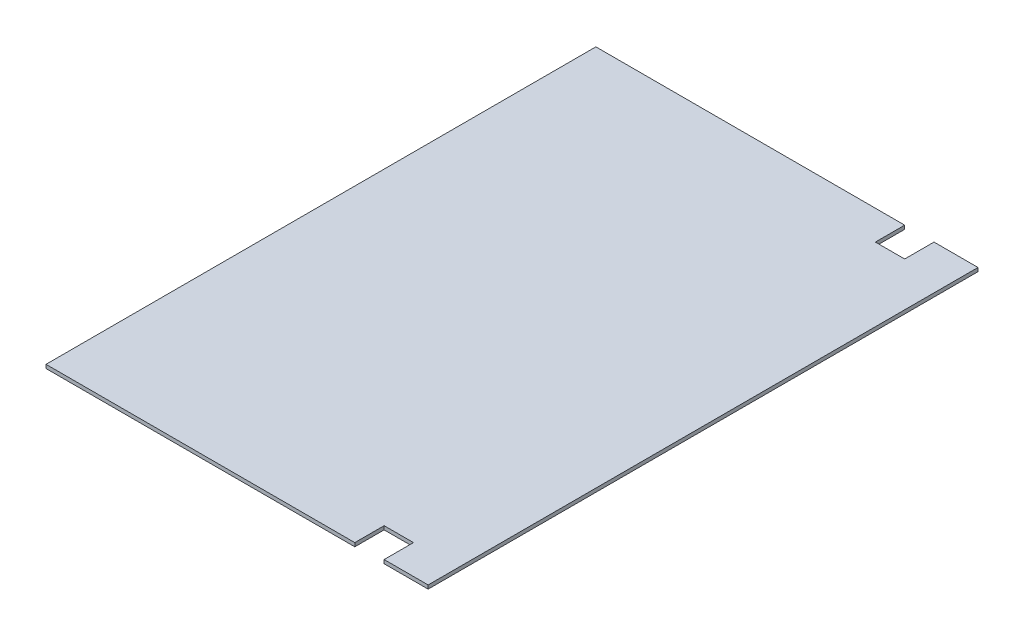
ISO-10303-21;
HEADER;
FILE_DESCRIPTION(('STEP AP214'),'2;1');
FILE_NAME('part.step','',(''),(''),'','','');
FILE_SCHEMA(('AUTOMOTIVE_DESIGN { 1 0 10303 214 1 1 1 1 }'));
ENDSEC;
DATA;
#1=APPLICATION_CONTEXT('core data for automotive mechanical design processes');
#2=APPLICATION_PROTOCOL_DEFINITION('international standard','automotive_design',2000,#1);
#3=PRODUCT_CONTEXT('',#1,'mechanical');
#4=PRODUCT('Part','Part','',(#3));
#5=PRODUCT_RELATED_PRODUCT_CATEGORY('part','',(#4));
#6=PRODUCT_DEFINITION_FORMATION('','',#4);
#7=PRODUCT_DEFINITION_CONTEXT('part definition',#1,'design');
#8=PRODUCT_DEFINITION('design','',#6,#7);
#9=PRODUCT_DEFINITION_SHAPE('','',#8);
#10=(LENGTH_UNIT() NAMED_UNIT(*) SI_UNIT(.MILLI.,.METRE.));
#11=(NAMED_UNIT(*) PLANE_ANGLE_UNIT() SI_UNIT($,.RADIAN.));
#12=(NAMED_UNIT(*) SI_UNIT($,.STERADIAN.) SOLID_ANGLE_UNIT());
#13=UNCERTAINTY_MEASURE_WITH_UNIT(LENGTH_MEASURE(1.E-05),#10,'distance_accuracy_value','');
#14=(GEOMETRIC_REPRESENTATION_CONTEXT(3) GLOBAL_UNCERTAINTY_ASSIGNED_CONTEXT((#13)) GLOBAL_UNIT_ASSIGNED_CONTEXT((#10,
#11,#12)) REPRESENTATION_CONTEXT('',''));
#15=CARTESIAN_POINT('',(0.,0.,0.));
#16=DIRECTION('',(0.,0.,1.));
#17=DIRECTION('',(1.,0.,0.));
#18=AXIS2_PLACEMENT_3D('',#15,#16,#17);
#19=CARTESIAN_POINT('',(0.,3.175,0.));
#20=DIRECTION('',(0.,0.,-1.));
#21=DIRECTION('',(-1.,0.,0.));
#22=AXIS2_PLACEMENT_3D('',#19,#20,#21);
#23=PLANE('',#22);
#24=DIRECTION('',(1.,0.,0.));
#25=VECTOR('',#24,1.);
#26=CARTESIAN_POINT('',(0.,0.,0.));
#27=LINE('',#26,#25);
#28=CARTESIAN_POINT('',(0.,0.,0.));
#29=VERTEX_POINT('',#28);
#30=CARTESIAN_POINT('',(267.462,0.,0.));
#31=VERTEX_POINT('',#30);
#32=EDGE_CURVE('E161',#29,#31,#27,.T.);
#33=ORIENTED_EDGE('',*,*,#32,.T.);
#34=DIRECTION('',(0.,1.,0.));
#35=VECTOR('',#34,1.);
#36=CARTESIAN_POINT('',(267.462,0.,0.));
#37=LINE('',#36,#35);
#38=CARTESIAN_POINT('',(267.462,3.175,0.));
#39=VERTEX_POINT('',#38);
#40=EDGE_CURVE('E144',#31,#39,#37,.T.);
#41=ORIENTED_EDGE('',*,*,#40,.T.);
#42=DIRECTION('',(1.,0.,0.));
#43=VECTOR('',#42,1.);
#44=CARTESIAN_POINT('',(0.,3.175,0.));
#45=LINE('',#44,#43);
#46=CARTESIAN_POINT('',(0.,3.175,0.));
#47=VERTEX_POINT('',#46);
#48=EDGE_CURVE('E191',#47,#39,#45,.T.);
#49=ORIENTED_EDGE('',*,*,#48,.F.);
#50=DIRECTION('',(0.,-1.,0.));
#51=VECTOR('',#50,1.);
#52=CARTESIAN_POINT('',(0.,3.175,0.));
#53=LINE('',#52,#51);
#54=EDGE_CURVE('E11',#47,#29,#53,.T.);
#55=ORIENTED_EDGE('',*,*,#54,.T.);
#56=EDGE_LOOP('',(#33,#41,#49,#55));
#57=FACE_BOUND('',#56,.T.);
#58=ADVANCED_FACE('F43',(#57),#23,.F.);
#59=CARTESIAN_POINT('',(0.,3.175,-476.25));
#60=DIRECTION('',(0.,0.,-1.));
#61=DIRECTION('',(-1.,0.,0.));
#62=AXIS2_PLACEMENT_3D('',#59,#60,#61);
#63=PLANE('',#62);
#64=DIRECTION('',(0.,1.,0.));
#65=VECTOR('',#64,1.);
#66=CARTESIAN_POINT('',(292.862,0.,-476.25));
#67=LINE('',#66,#65);
#68=CARTESIAN_POINT('',(292.862,0.,-476.25));
#69=VERTEX_POINT('',#68);
#70=CARTESIAN_POINT('',(292.862,3.175,-476.25));
#71=VERTEX_POINT('',#70);
#72=EDGE_CURVE('E221',#69,#71,#67,.T.);
#73=ORIENTED_EDGE('',*,*,#72,.T.);
#74=DIRECTION('',(1.,0.,0.));
#75=VECTOR('',#74,1.);
#76=CARTESIAN_POINT('',(0.,3.175,-476.25));
#77=LINE('',#76,#75);
#78=CARTESIAN_POINT('',(330.962,3.175,-476.25));
#79=VERTEX_POINT('',#78);
#80=EDGE_CURVE('E175',#71,#79,#77,.T.);
#81=ORIENTED_EDGE('',*,*,#80,.T.);
#82=DIRECTION('',(0.,-1.,0.));
#83=VECTOR('',#82,1.);
#84=CARTESIAN_POINT('',(330.962,3.175,-476.25));
#85=LINE('',#84,#83);
#86=CARTESIAN_POINT('',(330.962,0.,-476.25));
#87=VERTEX_POINT('',#86);
#88=EDGE_CURVE('E183',#79,#87,#85,.T.);
#89=ORIENTED_EDGE('',*,*,#88,.T.);
#90=DIRECTION('',(1.,0.,0.));
#91=VECTOR('',#90,1.);
#92=CARTESIAN_POINT('',(0.,0.,-476.25));
#93=LINE('',#92,#91);
#94=EDGE_CURVE('E206',#69,#87,#93,.T.);
#95=ORIENTED_EDGE('',*,*,#94,.F.);
#96=EDGE_LOOP('',(#73,#81,#89,#95));
#97=FACE_BOUND('',#96,.T.);
#98=ADVANCED_FACE('F220',(#97),#63,.T.);
#99=CARTESIAN_POINT('',(0.,3.175,0.));
#100=DIRECTION('',(-1.,0.,0.));
#101=DIRECTION('',(0.,0.,1.));
#102=AXIS2_PLACEMENT_3D('',#99,#100,#101);
#103=PLANE('',#102);
#104=DIRECTION('',(0.,0.,-1.));
#105=VECTOR('',#104,1.);
#106=CARTESIAN_POINT('',(0.,0.,0.));
#107=LINE('',#106,#105);
#108=CARTESIAN_POINT('',(0.,0.,-476.25));
#109=VERTEX_POINT('',#108);
#110=EDGE_CURVE('E204',#29,#109,#107,.T.);
#111=ORIENTED_EDGE('',*,*,#110,.F.);
#112=ORIENTED_EDGE('',*,*,#54,.F.);
#113=DIRECTION('',(0.,0.,-1.));
#114=VECTOR('',#113,1.);
#115=CARTESIAN_POINT('',(0.,3.175,0.));
#116=LINE('',#115,#114);
#117=CARTESIAN_POINT('',(0.,3.175,-476.25));
#118=VERTEX_POINT('',#117);
#119=EDGE_CURVE('E169',#47,#118,#116,.T.);
#120=ORIENTED_EDGE('',*,*,#119,.T.);
#121=DIRECTION('',(0.,-1.,0.));
#122=VECTOR('',#121,1.);
#123=CARTESIAN_POINT('',(0.,3.175,-476.25));
#124=LINE('',#123,#122);
#125=EDGE_CURVE('E47',#118,#109,#124,.T.);
#126=ORIENTED_EDGE('',*,*,#125,.T.);
#127=EDGE_LOOP('',(#111,#112,#120,#126));
#128=FACE_BOUND('',#127,.T.);
#129=ADVANCED_FACE('F45',(#128),#103,.T.);
#130=CARTESIAN_POINT('',(292.862,3.175,0.));
#131=VERTEX_POINT('',#130);
#132=CARTESIAN_POINT('',(330.962,3.175,0.));
#133=VERTEX_POINT('',#132);
#134=EDGE_CURVE('E195',#131,#133,#45,.T.);
#135=ORIENTED_EDGE('',*,*,#134,.F.);
#136=DIRECTION('',(0.,1.,0.));
#137=VECTOR('',#136,1.);
#138=CARTESIAN_POINT('',(292.862,0.,0.));
#139=LINE('',#138,#137);
#140=CARTESIAN_POINT('',(292.862,0.,0.));
#141=VERTEX_POINT('',#140);
#142=EDGE_CURVE('E155',#141,#131,#139,.T.);
#143=ORIENTED_EDGE('',*,*,#142,.F.);
#144=CARTESIAN_POINT('',(330.962,0.,0.));
#145=VERTEX_POINT('',#144);
#146=EDGE_CURVE('E170',#141,#145,#27,.T.);
#147=ORIENTED_EDGE('',*,*,#146,.T.);
#148=DIRECTION('',(0.,-1.,0.));
#149=VECTOR('',#148,1.);
#150=CARTESIAN_POINT('',(330.962,3.175,0.));
#151=LINE('',#150,#149);
#152=EDGE_CURVE('E53',#133,#145,#151,.T.);
#153=ORIENTED_EDGE('',*,*,#152,.F.);
#154=EDGE_LOOP('',(#135,#143,#147,#153));
#155=FACE_BOUND('',#154,.T.);
#156=ADVANCED_FACE('F288',(#155),#23,.F.);
#157=CARTESIAN_POINT('',(330.962,3.175,0.));
#158=DIRECTION('',(-1.,0.,0.));
#159=DIRECTION('',(0.,0.,1.));
#160=AXIS2_PLACEMENT_3D('',#157,#158,#159);
#161=PLANE('',#160);
#162=DIRECTION('',(0.,0.,-1.));
#163=VECTOR('',#162,1.);
#164=CARTESIAN_POINT('',(330.962,0.,0.));
#165=LINE('',#164,#163);
#166=EDGE_CURVE('E177',#145,#87,#165,.T.);
#167=ORIENTED_EDGE('',*,*,#166,.T.);
#168=ORIENTED_EDGE('',*,*,#88,.F.);
#169=DIRECTION('',(0.,0.,-1.));
#170=VECTOR('',#169,1.);
#171=CARTESIAN_POINT('',(330.962,3.175,0.));
#172=LINE('',#171,#170);
#173=EDGE_CURVE('E200',#133,#79,#172,.T.);
#174=ORIENTED_EDGE('',*,*,#173,.F.);
#175=ORIENTED_EDGE('',*,*,#152,.T.);
#176=EDGE_LOOP('',(#167,#168,#174,#175));
#177=FACE_BOUND('',#176,.T.);
#178=ADVANCED_FACE('F310',(#177),#161,.F.);
#179=DIRECTION('',(0.,1.,0.));
#180=VECTOR('',#179,1.);
#181=CARTESIAN_POINT('',(267.462,0.,-476.25));
#182=LINE('',#181,#180);
#183=CARTESIAN_POINT('',(267.462,0.,-476.25));
#184=VERTEX_POINT('',#183);
#185=CARTESIAN_POINT('',(267.462,3.175,-476.25));
#186=VERTEX_POINT('',#185);
#187=EDGE_CURVE('E226',#184,#186,#182,.T.);
#188=ORIENTED_EDGE('',*,*,#187,.F.);
#189=EDGE_CURVE('E208',#109,#184,#93,.T.);
#190=ORIENTED_EDGE('',*,*,#189,.F.);
#191=ORIENTED_EDGE('',*,*,#125,.F.);
#192=EDGE_CURVE('E234',#118,#186,#77,.T.);
#193=ORIENTED_EDGE('',*,*,#192,.T.);
#194=EDGE_LOOP('',(#188,#190,#191,#193));
#195=FACE_BOUND('',#194,.T.);
#196=ADVANCED_FACE('F306',(#195),#63,.T.);
#197=CARTESIAN_POINT('',(0.,3.175,0.));
#198=DIRECTION('',(0.,-1.,0.));
#199=DIRECTION('',(0.,0.,-1.));
#200=AXIS2_PLACEMENT_3D('',#197,#198,#199);
#201=PLANE('',#200);
#202=ORIENTED_EDGE('',*,*,#48,.T.);
#203=DIRECTION('',(0.,0.,1.));
#204=VECTOR('',#203,1.);
#205=CARTESIAN_POINT('',(267.462,3.175,0.));
#206=LINE('',#205,#204);
#207=CARTESIAN_POINT('',(267.462,3.175,-25.4));
#208=VERTEX_POINT('',#207);
#209=EDGE_CURVE('E149',#208,#39,#206,.T.);
#210=ORIENTED_EDGE('',*,*,#209,.F.);
#211=DIRECTION('',(-1.,0.,0.));
#212=VECTOR('',#211,1.);
#213=CARTESIAN_POINT('',(267.462,3.175,-25.4));
#214=LINE('',#213,#212);
#215=CARTESIAN_POINT('',(292.862,3.175,-25.4));
#216=VERTEX_POINT('',#215);
#217=EDGE_CURVE('E166',#216,#208,#214,.T.);
#218=ORIENTED_EDGE('',*,*,#217,.F.);
#219=DIRECTION('',(0.,0.,-1.));
#220=VECTOR('',#219,1.);
#221=CARTESIAN_POINT('',(292.862,3.175,0.));
#222=LINE('',#221,#220);
#223=EDGE_CURVE('E273',#131,#216,#222,.T.);
#224=ORIENTED_EDGE('',*,*,#223,.F.);
#225=ORIENTED_EDGE('',*,*,#134,.T.);
#226=ORIENTED_EDGE('',*,*,#173,.T.);
#227=ORIENTED_EDGE('',*,*,#80,.F.);
#228=DIRECTION('',(0.,0.,-1.));
#229=VECTOR('',#228,1.);
#230=CARTESIAN_POINT('',(292.862,3.175,-476.25));
#231=LINE('',#230,#229);
#232=CARTESIAN_POINT('',(292.862,3.175,-450.85));
#233=VERTEX_POINT('',#232);
#234=EDGE_CURVE('E231',#233,#71,#231,.T.);
#235=ORIENTED_EDGE('',*,*,#234,.F.);
#236=DIRECTION('',(1.,0.,0.));
#237=VECTOR('',#236,1.);
#238=CARTESIAN_POINT('',(292.862,3.175,-450.85));
#239=LINE('',#238,#237);
#240=CARTESIAN_POINT('',(267.462,3.175,-450.85));
#241=VERTEX_POINT('',#240);
#242=EDGE_CURVE('E246',#241,#233,#239,.T.);
#243=ORIENTED_EDGE('',*,*,#242,.F.);
#244=DIRECTION('',(0.,0.,1.));
#245=VECTOR('',#244,1.);
#246=CARTESIAN_POINT('',(267.462,3.175,-476.25));
#247=LINE('',#246,#245);
#248=EDGE_CURVE('E250',#186,#241,#247,.T.);
#249=ORIENTED_EDGE('',*,*,#248,.F.);
#250=ORIENTED_EDGE('',*,*,#192,.F.);
#251=ORIENTED_EDGE('',*,*,#119,.F.);
#252=EDGE_LOOP('',(#202,#210,#218,#224,#225,#226,#227,#235,#243,#249,#250,#251));
#253=FACE_BOUND('',#252,.T.);
#254=ADVANCED_FACE('F229',(#253),#201,.F.);
#255=CARTESIAN_POINT('',(0.,0.,0.));
#256=DIRECTION('',(0.,-1.,0.));
#257=DIRECTION('',(0.,0.,-1.));
#258=AXIS2_PLACEMENT_3D('',#255,#256,#257);
#259=PLANE('',#258);
#260=DIRECTION('',(0.,0.,1.));
#261=VECTOR('',#260,1.);
#262=CARTESIAN_POINT('',(267.462,0.,0.));
#263=LINE('',#262,#261);
#264=CARTESIAN_POINT('',(267.462,0.,-25.4));
#265=VERTEX_POINT('',#264);
#266=EDGE_CURVE('E147',#265,#31,#263,.T.);
#267=ORIENTED_EDGE('',*,*,#266,.T.);
#268=ORIENTED_EDGE('',*,*,#32,.F.);
#269=ORIENTED_EDGE('',*,*,#110,.T.);
#270=ORIENTED_EDGE('',*,*,#189,.T.);
#271=DIRECTION('',(0.,0.,1.));
#272=VECTOR('',#271,1.);
#273=CARTESIAN_POINT('',(267.462,0.,-476.25));
#274=LINE('',#273,#272);
#275=CARTESIAN_POINT('',(267.462,0.,-450.85));
#276=VERTEX_POINT('',#275);
#277=EDGE_CURVE('E258',#184,#276,#274,.T.);
#278=ORIENTED_EDGE('',*,*,#277,.T.);
#279=DIRECTION('',(1.,0.,0.));
#280=VECTOR('',#279,1.);
#281=CARTESIAN_POINT('',(292.862,0.,-450.85));
#282=LINE('',#281,#280);
#283=CARTESIAN_POINT('',(292.862,0.,-450.85));
#284=VERTEX_POINT('',#283);
#285=EDGE_CURVE('E72',#276,#284,#282,.T.);
#286=ORIENTED_EDGE('',*,*,#285,.T.);
#287=DIRECTION('',(0.,0.,-1.));
#288=VECTOR('',#287,1.);
#289=CARTESIAN_POINT('',(292.862,0.,-476.25));
#290=LINE('',#289,#288);
#291=EDGE_CURVE('E218',#284,#69,#290,.T.);
#292=ORIENTED_EDGE('',*,*,#291,.T.);
#293=ORIENTED_EDGE('',*,*,#94,.T.);
#294=ORIENTED_EDGE('',*,*,#166,.F.);
#295=ORIENTED_EDGE('',*,*,#146,.F.);
#296=DIRECTION('',(0.,0.,-1.));
#297=VECTOR('',#296,1.);
#298=CARTESIAN_POINT('',(292.862,0.,0.));
#299=LINE('',#298,#297);
#300=CARTESIAN_POINT('',(292.862,0.,-25.4));
#301=VERTEX_POINT('',#300);
#302=EDGE_CURVE('E165',#141,#301,#299,.T.);
#303=ORIENTED_EDGE('',*,*,#302,.T.);
#304=DIRECTION('',(-1.,0.,0.));
#305=VECTOR('',#304,1.);
#306=CARTESIAN_POINT('',(267.462,0.,-25.4));
#307=LINE('',#306,#305);
#308=EDGE_CURVE('E64',#301,#265,#307,.T.);
#309=ORIENTED_EDGE('',*,*,#308,.T.);
#310=EDGE_LOOP('',(#267,#268,#269,#270,#278,#286,#292,#293,#294,#295,#303,#309));
#311=FACE_BOUND('',#310,.T.);
#312=ADVANCED_FACE('F159',(#311),#259,.T.);
#313=CARTESIAN_POINT('',(292.862,0.,-476.25));
#314=DIRECTION('',(1.,0.,0.));
#315=DIRECTION('',(0.,0.,-1.));
#316=AXIS2_PLACEMENT_3D('',#313,#314,#315);
#317=PLANE('',#316);
#318=ORIENTED_EDGE('',*,*,#234,.T.);
#319=ORIENTED_EDGE('',*,*,#72,.F.);
#320=ORIENTED_EDGE('',*,*,#291,.F.);
#321=DIRECTION('',(0.,1.,0.));
#322=VECTOR('',#321,1.);
#323=CARTESIAN_POINT('',(292.862,0.,-450.85));
#324=LINE('',#323,#322);
#325=EDGE_CURVE('E243',#284,#233,#324,.T.);
#326=ORIENTED_EDGE('',*,*,#325,.T.);
#327=EDGE_LOOP('',(#318,#319,#320,#326));
#328=FACE_BOUND('',#327,.T.);
#329=ADVANCED_FACE('F324',(#328),#317,.F.);
#330=CARTESIAN_POINT('',(292.862,0.,-450.85));
#331=DIRECTION('',(0.,0.,1.));
#332=DIRECTION('',(1.,0.,0.));
#333=AXIS2_PLACEMENT_3D('',#330,#331,#332);
#334=PLANE('',#333);
#335=ORIENTED_EDGE('',*,*,#242,.T.);
#336=ORIENTED_EDGE('',*,*,#325,.F.);
#337=ORIENTED_EDGE('',*,*,#285,.F.);
#338=DIRECTION('',(0.,1.,0.));
#339=VECTOR('',#338,1.);
#340=CARTESIAN_POINT('',(267.462,0.,-450.85));
#341=LINE('',#340,#339);
#342=EDGE_CURVE('E240',#276,#241,#341,.T.);
#343=ORIENTED_EDGE('',*,*,#342,.T.);
#344=EDGE_LOOP('',(#335,#336,#337,#343));
#345=FACE_BOUND('',#344,.T.);
#346=ADVANCED_FACE('F323',(#345),#334,.F.);
#347=CARTESIAN_POINT('',(267.462,0.,-476.25));
#348=DIRECTION('',(-1.,0.,0.));
#349=DIRECTION('',(0.,0.,1.));
#350=AXIS2_PLACEMENT_3D('',#347,#348,#349);
#351=PLANE('',#350);
#352=ORIENTED_EDGE('',*,*,#248,.T.);
#353=ORIENTED_EDGE('',*,*,#342,.F.);
#354=ORIENTED_EDGE('',*,*,#277,.F.);
#355=ORIENTED_EDGE('',*,*,#187,.T.);
#356=EDGE_LOOP('',(#352,#353,#354,#355));
#357=FACE_BOUND('',#356,.T.);
#358=ADVANCED_FACE('F299',(#357),#351,.F.);
#359=CARTESIAN_POINT('',(267.462,0.,0.));
#360=DIRECTION('',(-1.,0.,0.));
#361=DIRECTION('',(0.,0.,1.));
#362=AXIS2_PLACEMENT_3D('',#359,#360,#361);
#363=PLANE('',#362);
#364=ORIENTED_EDGE('',*,*,#209,.T.);
#365=ORIENTED_EDGE('',*,*,#40,.F.);
#366=ORIENTED_EDGE('',*,*,#266,.F.);
#367=DIRECTION('',(0.,1.,0.));
#368=VECTOR('',#367,1.);
#369=CARTESIAN_POINT('',(267.462,0.,-25.4));
#370=LINE('',#369,#368);
#371=EDGE_CURVE('E207',#265,#208,#370,.T.);
#372=ORIENTED_EDGE('',*,*,#371,.T.);
#373=EDGE_LOOP('',(#364,#365,#366,#372));
#374=FACE_BOUND('',#373,.T.);
#375=ADVANCED_FACE('F146',(#374),#363,.F.);
#376=CARTESIAN_POINT('',(267.462,0.,-25.4));
#377=DIRECTION('',(0.,0.,-1.));
#378=DIRECTION('',(-1.,0.,0.));
#379=AXIS2_PLACEMENT_3D('',#376,#377,#378);
#380=PLANE('',#379);
#381=ORIENTED_EDGE('',*,*,#217,.T.);
#382=ORIENTED_EDGE('',*,*,#371,.F.);
#383=ORIENTED_EDGE('',*,*,#308,.F.);
#384=DIRECTION('',(0.,1.,0.));
#385=VECTOR('',#384,1.);
#386=CARTESIAN_POINT('',(292.862,0.,-25.4));
#387=LINE('',#386,#385);
#388=EDGE_CURVE('E265',#301,#216,#387,.T.);
#389=ORIENTED_EDGE('',*,*,#388,.T.);
#390=EDGE_LOOP('',(#381,#382,#383,#389));
#391=FACE_BOUND('',#390,.T.);
#392=ADVANCED_FACE('F291',(#391),#380,.F.);
#393=CARTESIAN_POINT('',(292.862,0.,0.));
#394=DIRECTION('',(1.,0.,0.));
#395=DIRECTION('',(0.,0.,-1.));
#396=AXIS2_PLACEMENT_3D('',#393,#394,#395);
#397=PLANE('',#396);
#398=ORIENTED_EDGE('',*,*,#223,.T.);
#399=ORIENTED_EDGE('',*,*,#388,.F.);
#400=ORIENTED_EDGE('',*,*,#302,.F.);
#401=ORIENTED_EDGE('',*,*,#142,.T.);
#402=EDGE_LOOP('',(#398,#399,#400,#401));
#403=FACE_BOUND('',#402,.T.);
#404=ADVANCED_FACE('F284',(#403),#397,.F.);
#405=CLOSED_SHELL('',(#58,#98,#129,#156,#178,#196,#254,#312,#329,#346,#358,#375,#392,#404));
#406=MANIFOLD_SOLID_BREP('B2',#405);
#407=ADVANCED_BREP_SHAPE_REPRESENTATION('',(#18,#406),#14);
#408=SHAPE_DEFINITION_REPRESENTATION(#9,#407);
ENDSEC;
END-ISO-10303-21;
